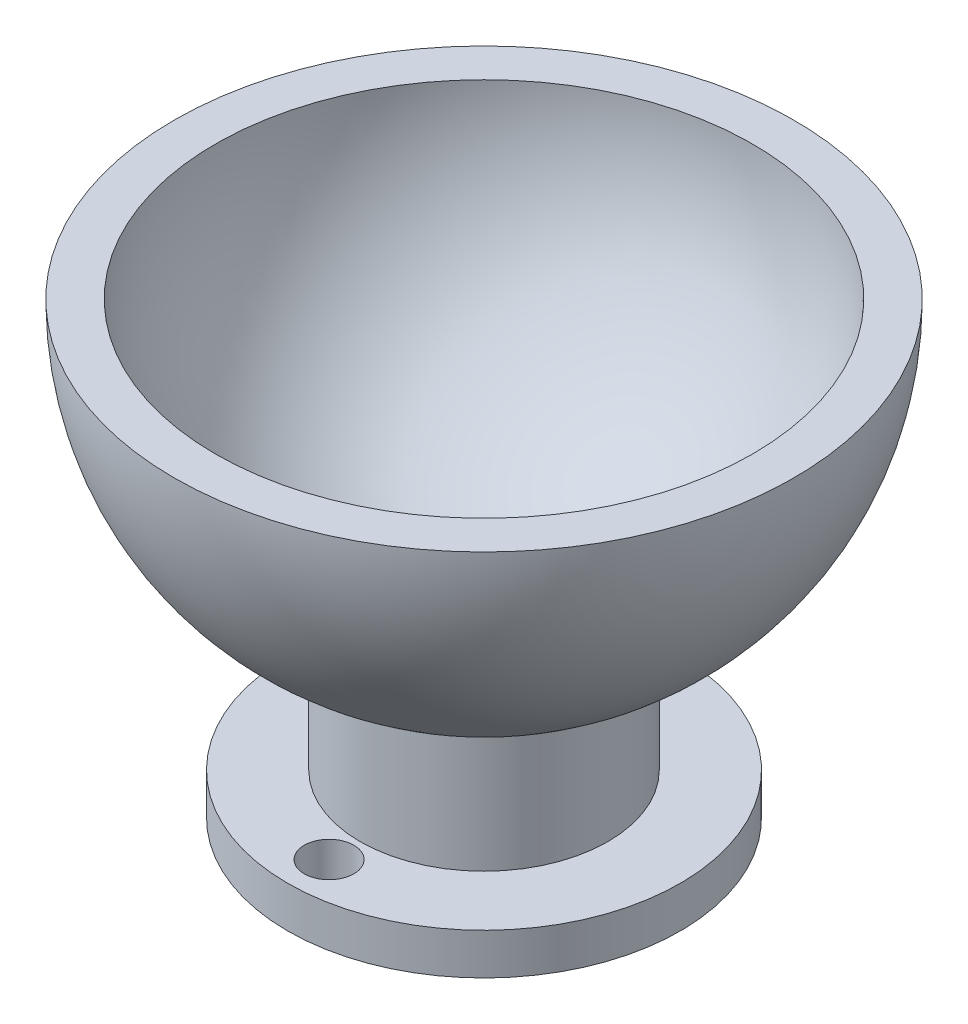
ISO-10303-21;
HEADER;
FILE_DESCRIPTION(('STEP AP214'),'2;1');
FILE_NAME('part.step','',(''),(''),'','','');
FILE_SCHEMA(('AUTOMOTIVE_DESIGN { 1 0 10303 214 1 1 1 1 }'));
ENDSEC;
DATA;
#1=APPLICATION_CONTEXT('core data for automotive mechanical design processes');
#2=APPLICATION_PROTOCOL_DEFINITION('international standard','automotive_design',2000,#1);
#3=PRODUCT_CONTEXT('',#1,'mechanical');
#4=PRODUCT('Part','Part','',(#3));
#5=PRODUCT_RELATED_PRODUCT_CATEGORY('part','',(#4));
#6=PRODUCT_DEFINITION_FORMATION('','',#4);
#7=PRODUCT_DEFINITION_CONTEXT('part definition',#1,'design');
#8=PRODUCT_DEFINITION('design','',#6,#7);
#9=PRODUCT_DEFINITION_SHAPE('','',#8);
#10=(LENGTH_UNIT() NAMED_UNIT(*) SI_UNIT(.MILLI.,.METRE.));
#11=(NAMED_UNIT(*) PLANE_ANGLE_UNIT() SI_UNIT($,.RADIAN.));
#12=(NAMED_UNIT(*) SI_UNIT($,.STERADIAN.) SOLID_ANGLE_UNIT());
#13=UNCERTAINTY_MEASURE_WITH_UNIT(LENGTH_MEASURE(1.E-05),#10,'distance_accuracy_value','');
#14=(GEOMETRIC_REPRESENTATION_CONTEXT(3) GLOBAL_UNCERTAINTY_ASSIGNED_CONTEXT((#13)) GLOBAL_UNIT_ASSIGNED_CONTEXT((#10,
#11,#12)) REPRESENTATION_CONTEXT('',''));
#15=CARTESIAN_POINT('',(0.,0.,0.));
#16=DIRECTION('',(0.,0.,1.));
#17=DIRECTION('',(1.,0.,0.));
#18=AXIS2_PLACEMENT_3D('',#15,#16,#17);
#19=CARTESIAN_POINT('',(0.,27.6196133977817,0.));
#20=DIRECTION('',(0.,1.,0.));
#21=DIRECTION('',(1.,0.,0.));
#22=AXIS2_PLACEMENT_3D('',#19,#20,#21);
#23=SPHERICAL_SURFACE('',#22,16.51);
#24=CARTESIAN_POINT('',(0.,27.6196133977817,0.));
#25=DIRECTION('',(0.,1.,0.));
#26=DIRECTION('',(0.,0.,1.));
#27=AXIS2_PLACEMENT_3D('',#24,#25,#26);
#28=CIRCLE('',#27,16.51);
#29=CARTESIAN_POINT('',(0.,27.6196133977817,16.51));
#30=VERTEX_POINT('',#29);
#31=EDGE_CURVE('E45',#30,#30,#28,.T.);
#32=ORIENTED_EDGE('',*,*,#31,.T.);
#33=EDGE_LOOP('',(#32));
#34=FACE_BOUND('',#33,.T.);
#35=ADVANCED_FACE('F39',(#34),#23,.F.);
#36=CARTESIAN_POINT('',(0.,27.6196133977817,0.));
#37=DIRECTION('',(0.,1.,0.));
#38=DIRECTION('',(-1.,0.,0.));
#39=AXIS2_PLACEMENT_3D('',#36,#37,#38);
#40=SPHERICAL_SURFACE('',#39,19.05);
#41=CARTESIAN_POINT('',(0.,27.6196133977817,0.));
#42=DIRECTION('',(0.,1.,0.));
#43=DIRECTION('',(0.,0.,1.));
#44=AXIS2_PLACEMENT_3D('',#41,#42,#43);
#45=CIRCLE('',#44,19.05);
#46=CARTESIAN_POINT('',(0.,27.6196133977817,19.05));
#47=VERTEX_POINT('',#46);
#48=EDGE_CURVE('E11',#47,#47,#45,.T.);
#49=ORIENTED_EDGE('',*,*,#48,.F.);
#50=EDGE_LOOP('',(#49));
#51=FACE_BOUND('',#50,.T.);
#52=ADVANCED_FACE('F54',(#51),#40,.T.);
#53=CARTESIAN_POINT('',(16.51,27.6196133977817,0.));
#54=DIRECTION('',(0.,-1.,0.));
#55=DIRECTION('',(0.,0.,-1.));
#56=AXIS2_PLACEMENT_3D('',#53,#54,#55);
#57=PLANE('',#56);
#58=ORIENTED_EDGE('',*,*,#31,.F.);
#59=EDGE_LOOP('',(#58));
#60=FACE_BOUND('',#59,.T.);
#61=ORIENTED_EDGE('',*,*,#48,.T.);
#62=EDGE_LOOP('',(#61));
#63=FACE_BOUND('',#62,.T.);
#64=ADVANCED_FACE('F52',(#60,#63),#57,.F.);
#65=CLOSED_SHELL('',(#35,#52,#64));
#66=MANIFOLD_SOLID_BREP('B2',#65);
#67=CARTESIAN_POINT('',(0.,2.54,0.));
#68=DIRECTION('',(0.,-1.,0.));
#69=DIRECTION('',(0.,0.,-1.));
#70=AXIS2_PLACEMENT_3D('',#67,#68,#69);
#71=CYLINDRICAL_SURFACE('',#70,12.065);
#72=CARTESIAN_POINT('',(0.,2.54,0.));
#73=DIRECTION('',(0.,1.,0.));
#74=DIRECTION('',(0.,0.,1.));
#75=AXIS2_PLACEMENT_3D('',#72,#73,#74);
#76=CIRCLE('',#75,12.065);
#77=CARTESIAN_POINT('',(0.,2.54,12.065));
#78=VERTEX_POINT('',#77);
#79=EDGE_CURVE('E87',#78,#78,#76,.T.);
#80=ORIENTED_EDGE('',*,*,#79,.F.);
#81=EDGE_LOOP('',(#80));
#82=FACE_BOUND('',#81,.T.);
#83=CARTESIAN_POINT('',(0.,0.,0.));
#84=DIRECTION('',(0.,1.,0.));
#85=DIRECTION('',(0.,0.,1.));
#86=AXIS2_PLACEMENT_3D('',#83,#84,#85);
#87=CIRCLE('',#86,12.065);
#88=CARTESIAN_POINT('',(0.,0.,12.065));
#89=VERTEX_POINT('',#88);
#90=EDGE_CURVE('E83',#89,#89,#87,.T.);
#91=ORIENTED_EDGE('',*,*,#90,.T.);
#92=EDGE_LOOP('',(#91));
#93=FACE_BOUND('',#92,.T.);
#94=ADVANCED_FACE('F80',(#82,#93),#71,.T.);
#95=CARTESIAN_POINT('',(0.,2.54,0.));
#96=DIRECTION('',(0.,1.,0.));
#97=DIRECTION('',(0.,0.,1.));
#98=AXIS2_PLACEMENT_3D('',#95,#96,#97);
#99=PLANE('',#98);
#100=CARTESIAN_POINT('',(0.,2.54,9.525));
#101=DIRECTION('',(0.,1.,0.));
#102=DIRECTION('',(0.,0.,1.));
#103=AXIS2_PLACEMENT_3D('',#100,#101,#102);
#104=CIRCLE('',#103,1.524);
#105=CARTESIAN_POINT('',(0.,2.54,11.049));
#106=VERTEX_POINT('',#105);
#107=EDGE_CURVE('E96',#106,#106,#104,.T.);
#108=ORIENTED_EDGE('',*,*,#107,.F.);
#109=EDGE_LOOP('',(#108));
#110=FACE_BOUND('',#109,.T.);
#111=CARTESIAN_POINT('',(0.,2.54,0.));
#112=DIRECTION('',(0.,1.,0.));
#113=DIRECTION('',(0.,0.,1.));
#114=AXIS2_PLACEMENT_3D('',#111,#112,#113);
#115=CIRCLE('',#114,7.62);
#116=CARTESIAN_POINT('',(0.,2.54,-7.62));
#117=VERTEX_POINT('',#116);
#118=EDGE_CURVE('E38',#117,#117,#115,.T.);
#119=ORIENTED_EDGE('',*,*,#118,.F.);
#120=EDGE_LOOP('',(#119));
#121=FACE_BOUND('',#120,.T.);
#122=ORIENTED_EDGE('',*,*,#79,.T.);
#123=EDGE_LOOP('',(#122));
#124=FACE_BOUND('',#123,.T.);
#125=ADVANCED_FACE('F109',(#110,#121,#124),#99,.T.);
#126=CARTESIAN_POINT('',(0.,0.,0.));
#127=DIRECTION('',(0.,1.,0.));
#128=DIRECTION('',(0.,0.,1.));
#129=AXIS2_PLACEMENT_3D('',#126,#127,#128);
#130=PLANE('',#129);
#131=CARTESIAN_POINT('',(0.,0.,9.525));
#132=DIRECTION('',(0.,-1.,0.));
#133=DIRECTION('',(0.,0.,-1.));
#134=AXIS2_PLACEMENT_3D('',#131,#132,#133);
#135=CIRCLE('',#134,1.524);
#136=CARTESIAN_POINT('',(0.,0.,8.001));
#137=VERTEX_POINT('',#136);
#138=EDGE_CURVE('E99',#137,#137,#135,.T.);
#139=ORIENTED_EDGE('',*,*,#138,.F.);
#140=EDGE_LOOP('',(#139));
#141=FACE_BOUND('',#140,.T.);
#142=ORIENTED_EDGE('',*,*,#90,.F.);
#143=EDGE_LOOP('',(#142));
#144=FACE_BOUND('',#143,.T.);
#145=ADVANCED_FACE('F105',(#141,#144),#130,.F.);
#146=CARTESIAN_POINT('',(0.,10.16,0.));
#147=DIRECTION('',(0.,-1.,0.));
#148=DIRECTION('',(0.,0.,-1.));
#149=AXIS2_PLACEMENT_3D('',#146,#147,#148);
#150=CYLINDRICAL_SURFACE('',#149,7.62);
#151=CARTESIAN_POINT('',(0.,10.16,0.));
#152=DIRECTION('',(0.,1.,0.));
#153=DIRECTION('',(0.,0.,1.));
#154=AXIS2_PLACEMENT_3D('',#151,#152,#153);
#155=CIRCLE('',#154,7.62);
#156=CARTESIAN_POINT('',(0.,10.16,-7.62));
#157=VERTEX_POINT('',#156);
#158=EDGE_CURVE('E93',#157,#157,#155,.T.);
#159=CARTESIAN_POINT('',(0.,10.16,-7.62));
#160=CARTESIAN_POINT('',(0.,10.080625,-7.62));
#161=CARTESIAN_POINT('',(0.,10.00125,-7.62));
#162=CARTESIAN_POINT('',(0.,9.8425,-7.62));
#163=CARTESIAN_POINT('',(0.,9.763125,-7.62));
#164=CARTESIAN_POINT('',(0.,9.604375,-7.62));
#165=CARTESIAN_POINT('',(0.,9.525,-7.62));
#166=CARTESIAN_POINT('',(0.,9.36625,-7.62));
#167=CARTESIAN_POINT('',(0.,9.286875,-7.62));
#168=CARTESIAN_POINT('',(0.,9.128125,-7.62));
#169=CARTESIAN_POINT('',(0.,9.04875,-7.62));
#170=CARTESIAN_POINT('',(0.,8.89,-7.62));
#171=CARTESIAN_POINT('',(0.,8.810625,-7.62));
#172=CARTESIAN_POINT('',(0.,8.651875,-7.62));
#173=CARTESIAN_POINT('',(0.,8.5725,-7.62));
#174=CARTESIAN_POINT('',(0.,8.41375,-7.62));
#175=CARTESIAN_POINT('',(0.,8.334375,-7.62));
#176=CARTESIAN_POINT('',(0.,8.175625,-7.62));
#177=CARTESIAN_POINT('',(0.,8.09625,-7.62));
#178=CARTESIAN_POINT('',(0.,7.9375,-7.62));
#179=CARTESIAN_POINT('',(0.,7.858125,-7.62));
#180=CARTESIAN_POINT('',(0.,7.699375,-7.62));
#181=CARTESIAN_POINT('',(0.,7.62,-7.62));
#182=CARTESIAN_POINT('',(0.,7.46125,-7.62));
#183=CARTESIAN_POINT('',(0.,7.381875,-7.62));
#184=CARTESIAN_POINT('',(0.,7.223125,-7.62));
#185=CARTESIAN_POINT('',(0.,7.14375,-7.62));
#186=CARTESIAN_POINT('',(0.,6.985,-7.62));
#187=CARTESIAN_POINT('',(0.,6.905625,-7.62));
#188=CARTESIAN_POINT('',(0.,6.746875,-7.62));
#189=CARTESIAN_POINT('',(0.,6.6675,-7.62));
#190=CARTESIAN_POINT('',(0.,6.50875,-7.62));
#191=CARTESIAN_POINT('',(0.,6.429375,-7.62));
#192=CARTESIAN_POINT('',(0.,6.270625,-7.62));
#193=CARTESIAN_POINT('',(0.,6.19125,-7.62));
#194=CARTESIAN_POINT('',(0.,6.0325,-7.62));
#195=CARTESIAN_POINT('',(0.,5.953125,-7.62));
#196=CARTESIAN_POINT('',(0.,5.794375,-7.62));
#197=CARTESIAN_POINT('',(0.,5.715,-7.62));
#198=CARTESIAN_POINT('',(0.,5.55625,-7.62));
#199=CARTESIAN_POINT('',(0.,5.476875,-7.62));
#200=CARTESIAN_POINT('',(0.,5.318125,-7.62));
#201=CARTESIAN_POINT('',(0.,5.23875,-7.62));
#202=CARTESIAN_POINT('',(0.,5.08,-7.62));
#203=CARTESIAN_POINT('',(0.,5.000625,-7.62));
#204=CARTESIAN_POINT('',(0.,4.841875,-7.62));
#205=CARTESIAN_POINT('',(0.,4.7625,-7.62));
#206=CARTESIAN_POINT('',(0.,4.60375,-7.62));
#207=CARTESIAN_POINT('',(0.,4.524375,-7.62));
#208=CARTESIAN_POINT('',(0.,4.365625,-7.62));
#209=CARTESIAN_POINT('',(0.,4.28625,-7.62));
#210=CARTESIAN_POINT('',(0.,4.1275,-7.62));
#211=CARTESIAN_POINT('',(0.,4.048125,-7.62));
#212=CARTESIAN_POINT('',(0.,3.889375,-7.62));
#213=CARTESIAN_POINT('',(0.,3.81,-7.62));
#214=CARTESIAN_POINT('',(0.,3.65125,-7.62));
#215=CARTESIAN_POINT('',(0.,3.571875,-7.62));
#216=CARTESIAN_POINT('',(0.,3.413125,-7.62));
#217=CARTESIAN_POINT('',(0.,3.33375,-7.62));
#218=CARTESIAN_POINT('',(0.,3.175,-7.62));
#219=CARTESIAN_POINT('',(0.,3.095625,-7.62));
#220=CARTESIAN_POINT('',(0.,2.936875,-7.62));
#221=CARTESIAN_POINT('',(0.,2.8575,-7.62));
#222=CARTESIAN_POINT('',(0.,2.69875,-7.62));
#223=CARTESIAN_POINT('',(0.,2.619375,-7.62));
#224=CARTESIAN_POINT('',(0.,2.54,-7.62));
#225=B_SPLINE_CURVE_WITH_KNOTS('',3,(#159,#160,#161,#162,#163,#164,#165,#166,#167,#168,#169,
#170,#171,#172,#173,#174,#175,#176,#177,#178,#179,#180,#181,#182,#183,#184,#185,#186,#187,#188,
#189,#190,#191,#192,#193,#194,#195,#196,#197,#198,#199,#200,#201,#202,#203,#204,#205,#206,#207,
#208,#209,#210,#211,#212,#213,#214,#215,#216,#217,#218,#219,#220,#221,#222,#223,#224),
.UNSPECIFIED.,.F.,.F.,(4,2,2,2,2,2,2,2,2,2,2,2,2,2,2,2,2,2,2,2,2,2,2,2,2,2,2,2,2,2,2,2,4),(0.,
0.238124999999999,0.476249999999999,0.714375,0.952499999999998,1.190625,1.42875,1.666875,1.905,
2.143125,2.38125,2.619375,2.8575,3.095625,3.33375,3.571875,3.81,4.048125,4.28625,4.524375,
4.7625,5.000625,5.23875,5.476875,5.715,5.953125,6.19125,6.429375,6.6675,6.905625,7.14375,
7.381875,7.62),.UNSPECIFIED.);
#226=EDGE_CURVE('BSEAM108',#157,#117,#225,.T.);
#227=ORIENTED_EDGE('',*,*,#158,.F.);
#228=ORIENTED_EDGE('',*,*,#118,.T.);
#229=ORIENTED_EDGE('',*,*,#226,.T.);
#230=ORIENTED_EDGE('',*,*,#226,.F.);
#231=EDGE_LOOP('',(#227,#229,#228,#230));
#232=FACE_BOUND('',#231,.T.);
#233=ADVANCED_FACE('F108',(#232),#150,.T.);
#234=CARTESIAN_POINT('',(0.,10.16,0.));
#235=DIRECTION('',(0.,1.,0.));
#236=DIRECTION('',(0.,0.,1.));
#237=AXIS2_PLACEMENT_3D('',#234,#235,#236);
#238=PLANE('',#237);
#239=ORIENTED_EDGE('',*,*,#158,.T.);
#240=EDGE_LOOP('',(#239));
#241=FACE_BOUND('',#240,.T.);
#242=ADVANCED_FACE('F129',(#241),#238,.T.);
#243=CARTESIAN_POINT('',(0.,5.08,9.525));
#244=DIRECTION('',(0.,-1.,0.));
#245=DIRECTION('',(0.,0.,-1.));
#246=AXIS2_PLACEMENT_3D('',#243,#244,#245);
#247=CYLINDRICAL_SURFACE('',#246,1.524);
#248=ORIENTED_EDGE('',*,*,#107,.T.);
#249=EDGE_LOOP('',(#248));
#250=FACE_BOUND('',#249,.T.);
#251=ORIENTED_EDGE('',*,*,#138,.T.);
#252=EDGE_LOOP('',(#251));
#253=FACE_BOUND('',#252,.T.);
#254=ADVANCED_FACE('F103',(#250,#253),#247,.F.);
#255=CLOSED_SHELL('',(#94,#125,#145,#233,#242,#254));
#256=MANIFOLD_SOLID_BREP('B6',#255);
#257=ADVANCED_BREP_SHAPE_REPRESENTATION('',(#18,#66,#256),#14);
#258=SHAPE_DEFINITION_REPRESENTATION(#9,#257);
ENDSEC;
END-ISO-10303-21;
